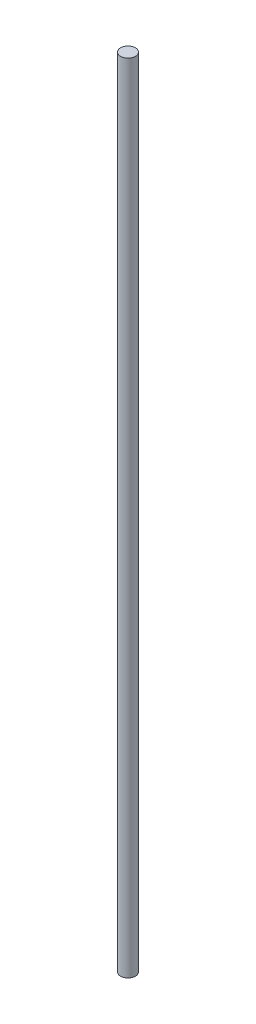
ISO-10303-21;
HEADER;
FILE_DESCRIPTION(('STEP AP214'),'2;1');
FILE_NAME('part.step','',(''),(''),'','','');
FILE_SCHEMA(('AUTOMOTIVE_DESIGN { 1 0 10303 214 1 1 1 1 }'));
ENDSEC;
DATA;
#1=APPLICATION_CONTEXT('core data for automotive mechanical design processes');
#2=APPLICATION_PROTOCOL_DEFINITION('international standard','automotive_design',2000,#1);
#3=PRODUCT_CONTEXT('',#1,'mechanical');
#4=PRODUCT('Part','Part','',(#3));
#5=PRODUCT_RELATED_PRODUCT_CATEGORY('part','',(#4));
#6=PRODUCT_DEFINITION_FORMATION('','',#4);
#7=PRODUCT_DEFINITION_CONTEXT('part definition',#1,'design');
#8=PRODUCT_DEFINITION('design','',#6,#7);
#9=PRODUCT_DEFINITION_SHAPE('','',#8);
#10=(LENGTH_UNIT() NAMED_UNIT(*) SI_UNIT(.MILLI.,.METRE.));
#11=(NAMED_UNIT(*) PLANE_ANGLE_UNIT() SI_UNIT($,.RADIAN.));
#12=(NAMED_UNIT(*) SI_UNIT($,.STERADIAN.) SOLID_ANGLE_UNIT());
#13=UNCERTAINTY_MEASURE_WITH_UNIT(LENGTH_MEASURE(1.E-05),#10,'distance_accuracy_value','');
#14=(GEOMETRIC_REPRESENTATION_CONTEXT(3) GLOBAL_UNCERTAINTY_ASSIGNED_CONTEXT((#13)) GLOBAL_UNIT_ASSIGNED_CONTEXT((#10,
#11,#12)) REPRESENTATION_CONTEXT('',''));
#15=CARTESIAN_POINT('',(0.,0.,0.));
#16=DIRECTION('',(0.,0.,1.));
#17=DIRECTION('',(1.,0.,0.));
#18=AXIS2_PLACEMENT_3D('',#15,#16,#17);
#19=CARTESIAN_POINT('',(0.,430.,0.));
#20=DIRECTION('',(0.,-1.,0.));
#21=DIRECTION('',(0.,0.,-1.));
#22=AXIS2_PLACEMENT_3D('',#19,#20,#21);
#23=CYLINDRICAL_SURFACE('',#22,4.);
#24=CARTESIAN_POINT('',(0.,430.,0.));
#25=DIRECTION('',(0.,1.,0.));
#26=DIRECTION('',(0.,0.,1.));
#27=AXIS2_PLACEMENT_3D('',#24,#25,#26);
#28=CIRCLE('',#27,4.);
#29=CARTESIAN_POINT('',(0.,430.,4.));
#30=VERTEX_POINT('',#29);
#31=EDGE_CURVE('E10',#30,#30,#28,.T.);
#32=ORIENTED_EDGE('',*,*,#31,.F.);
#33=EDGE_LOOP('',(#32));
#34=FACE_BOUND('',#33,.T.);
#35=CARTESIAN_POINT('',(0.,0.,0.));
#36=DIRECTION('',(0.,1.,0.));
#37=DIRECTION('',(0.,0.,1.));
#38=AXIS2_PLACEMENT_3D('',#35,#36,#37);
#39=CIRCLE('',#38,4.);
#40=CARTESIAN_POINT('',(0.,0.,4.));
#41=VERTEX_POINT('',#40);
#42=EDGE_CURVE('E42',#41,#41,#39,.T.);
#43=ORIENTED_EDGE('',*,*,#42,.T.);
#44=EDGE_LOOP('',(#43));
#45=FACE_BOUND('',#44,.T.);
#46=ADVANCED_FACE('F39',(#34,#45),#23,.T.);
#47=CARTESIAN_POINT('',(0.,430.,0.));
#48=DIRECTION('',(0.,1.,0.));
#49=DIRECTION('',(0.,0.,1.));
#50=AXIS2_PLACEMENT_3D('',#47,#48,#49);
#51=PLANE('',#50);
#52=ORIENTED_EDGE('',*,*,#31,.T.);
#53=EDGE_LOOP('',(#52));
#54=FACE_BOUND('',#53,.T.);
#55=ADVANCED_FACE('F56',(#54),#51,.T.);
#56=CARTESIAN_POINT('',(0.,0.,0.));
#57=DIRECTION('',(0.,1.,0.));
#58=DIRECTION('',(0.,0.,1.));
#59=AXIS2_PLACEMENT_3D('',#56,#57,#58);
#60=PLANE('',#59);
#61=ORIENTED_EDGE('',*,*,#42,.F.);
#62=EDGE_LOOP('',(#61));
#63=FACE_BOUND('',#62,.T.);
#64=ADVANCED_FACE('F54',(#63),#60,.F.);
#65=CLOSED_SHELL('',(#46,#55,#64));
#66=MANIFOLD_SOLID_BREP('B2',#65);
#67=ADVANCED_BREP_SHAPE_REPRESENTATION('',(#18,#66),#14);
#68=SHAPE_DEFINITION_REPRESENTATION(#9,#67);
ENDSEC;
END-ISO-10303-21;
